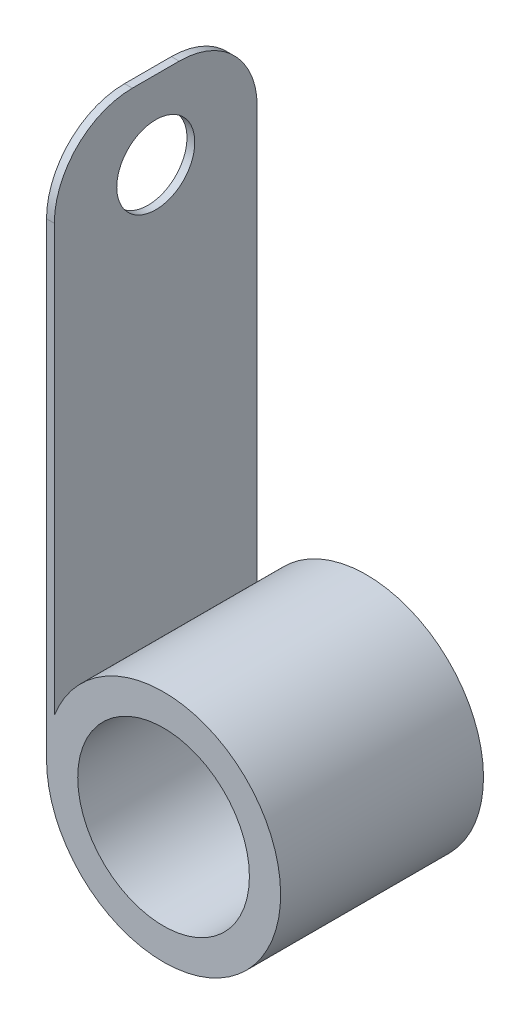
ISO-10303-21;
HEADER;
FILE_DESCRIPTION(('STEP AP214'),'2;1');
FILE_NAME('part.step','',(''),(''),'','','');
FILE_SCHEMA(('AUTOMOTIVE_DESIGN { 1 0 10303 214 1 1 1 1 }'));
ENDSEC;
DATA;
#1=APPLICATION_CONTEXT('core data for automotive mechanical design processes');
#2=APPLICATION_PROTOCOL_DEFINITION('international standard','automotive_design',2000,#1);
#3=PRODUCT_CONTEXT('',#1,'mechanical');
#4=PRODUCT('Part','Part','',(#3));
#5=PRODUCT_RELATED_PRODUCT_CATEGORY('part','',(#4));
#6=PRODUCT_DEFINITION_FORMATION('','',#4);
#7=PRODUCT_DEFINITION_CONTEXT('part definition',#1,'design');
#8=PRODUCT_DEFINITION('design','',#6,#7);
#9=PRODUCT_DEFINITION_SHAPE('','',#8);
#10=(LENGTH_UNIT() NAMED_UNIT(*) SI_UNIT(.MILLI.,.METRE.));
#11=(NAMED_UNIT(*) PLANE_ANGLE_UNIT() SI_UNIT($,.RADIAN.));
#12=(NAMED_UNIT(*) SI_UNIT($,.STERADIAN.) SOLID_ANGLE_UNIT());
#13=UNCERTAINTY_MEASURE_WITH_UNIT(LENGTH_MEASURE(1.E-05),#10,'distance_accuracy_value','');
#14=(GEOMETRIC_REPRESENTATION_CONTEXT(3) GLOBAL_UNCERTAINTY_ASSIGNED_CONTEXT((#13)) GLOBAL_UNIT_ASSIGNED_CONTEXT((#10,
#11,#12)) REPRESENTATION_CONTEXT('',''));
#15=CARTESIAN_POINT('',(0.,0.,0.));
#16=DIRECTION('',(0.,0.,1.));
#17=DIRECTION('',(1.,0.,0.));
#18=AXIS2_PLACEMENT_3D('',#15,#16,#17);
#19=CARTESIAN_POINT('',(0.,0.,13.));
#20=DIRECTION('',(0.,0.,-1.));
#21=DIRECTION('',(-1.,0.,0.));
#22=AXIS2_PLACEMENT_3D('',#19,#20,#21);
#23=CYLINDRICAL_SURFACE('',#22,7.5);
#24=DIRECTION('',(0.,0.,-1.));
#25=VECTOR('',#24,1.);
#26=CARTESIAN_POINT('',(-7.,2.69258240356726,13.));
#27=LINE('',#26,#25);
#28=CARTESIAN_POINT('',(-7.,2.69258240356726,13.));
#29=VERTEX_POINT('',#28);
#30=CARTESIAN_POINT('',(-7.,2.69258240356725,0.));
#31=VERTEX_POINT('',#30);
#32=EDGE_CURVE('E107',#29,#31,#27,.T.);
#33=ORIENTED_EDGE('',*,*,#32,.F.);
#34=CARTESIAN_POINT('',(0.,0.,13.));
#35=DIRECTION('',(0.,0.,1.));
#36=DIRECTION('',(1.,0.,0.));
#37=AXIS2_PLACEMENT_3D('',#34,#35,#36);
#38=CIRCLE('',#37,7.5);
#39=CARTESIAN_POINT('',(-7.5,0.,13.));
#40=VERTEX_POINT('',#39);
#41=EDGE_CURVE('E92',#40,#29,#38,.T.);
#42=ORIENTED_EDGE('',*,*,#41,.F.);
#43=DIRECTION('',(0.,0.,1.));
#44=VECTOR('',#43,1.);
#45=CARTESIAN_POINT('',(-7.5,0.,0.));
#46=LINE('',#45,#44);
#47=CARTESIAN_POINT('',(-7.5,0.,0.));
#48=VERTEX_POINT('',#47);
#49=EDGE_CURVE('E104',#48,#40,#46,.T.);
#50=ORIENTED_EDGE('',*,*,#49,.F.);
#51=CARTESIAN_POINT('',(0.,0.,0.));
#52=DIRECTION('',(0.,0.,1.));
#53=DIRECTION('',(1.,0.,0.));
#54=AXIS2_PLACEMENT_3D('',#51,#52,#53);
#55=CIRCLE('',#54,7.5);
#56=EDGE_CURVE('E108',#48,#31,#55,.T.);
#57=ORIENTED_EDGE('',*,*,#56,.T.);
#58=EDGE_LOOP('',(#33,#42,#50,#57));
#59=FACE_BOUND('',#58,.T.);
#60=ADVANCED_FACE('F35',(#59),#23,.T.);
#61=CARTESIAN_POINT('',(0.,0.,13.));
#62=DIRECTION('',(0.,0.,1.));
#63=DIRECTION('',(1.,0.,0.));
#64=AXIS2_PLACEMENT_3D('',#61,#62,#63);
#65=PLANE('',#64);
#66=DIRECTION('',(0.,-1.,0.));
#67=VECTOR('',#66,1.);
#68=CARTESIAN_POINT('',(-7.,35.,13.));
#69=LINE('',#68,#67);
#70=CARTESIAN_POINT('',(-7.,30.,13.));
#71=VERTEX_POINT('',#70);
#72=EDGE_CURVE('E98',#71,#29,#69,.T.);
#73=ORIENTED_EDGE('',*,*,#72,.F.);
#74=DIRECTION('',(1.,0.,0.));
#75=VECTOR('',#74,1.);
#76=CARTESIAN_POINT('',(0.,30.,13.));
#77=LINE('',#76,#75);
#78=CARTESIAN_POINT('',(-7.5,30.,13.));
#79=VERTEX_POINT('',#78);
#80=EDGE_CURVE('E11',#71,#79,#77,.F.);
#81=ORIENTED_EDGE('',*,*,#80,.T.);
#82=DIRECTION('',(0.,-1.,0.));
#83=VECTOR('',#82,1.);
#84=CARTESIAN_POINT('',(-7.5,35.,13.));
#85=LINE('',#84,#83);
#86=EDGE_CURVE('E88',#79,#40,#85,.T.);
#87=ORIENTED_EDGE('',*,*,#86,.T.);
#88=ORIENTED_EDGE('',*,*,#41,.T.);
#89=EDGE_LOOP('',(#73,#81,#87,#88));
#90=FACE_BOUND('',#89,.T.);
#91=CARTESIAN_POINT('',(0.,0.,13.));
#92=DIRECTION('',(0.,0.,1.));
#93=DIRECTION('',(1.,0.,0.));
#94=AXIS2_PLACEMENT_3D('',#91,#92,#93);
#95=CIRCLE('',#94,5.5);
#96=CARTESIAN_POINT('',(-5.5,0.,13.));
#97=VERTEX_POINT('',#96);
#98=EDGE_CURVE('E128',#97,#97,#95,.T.);
#99=ORIENTED_EDGE('',*,*,#98,.F.);
#100=EDGE_LOOP('',(#99));
#101=FACE_BOUND('',#100,.T.);
#102=ADVANCED_FACE('F90',(#90,#101),#65,.T.);
#103=CARTESIAN_POINT('',(0.,0.,0.));
#104=DIRECTION('',(0.,0.,1.));
#105=DIRECTION('',(1.,0.,0.));
#106=AXIS2_PLACEMENT_3D('',#103,#104,#105);
#107=PLANE('',#106);
#108=DIRECTION('',(0.,-1.,0.));
#109=VECTOR('',#108,1.);
#110=CARTESIAN_POINT('',(-7.5,35.,0.));
#111=LINE('',#110,#109);
#112=CARTESIAN_POINT('',(-7.5,30.,0.));
#113=VERTEX_POINT('',#112);
#114=EDGE_CURVE('E112',#113,#48,#111,.T.);
#115=ORIENTED_EDGE('',*,*,#114,.F.);
#116=DIRECTION('',(-1.,0.,0.));
#117=VECTOR('',#116,1.);
#118=CARTESIAN_POINT('',(-7.,30.,0.));
#119=LINE('',#118,#117);
#120=CARTESIAN_POINT('',(-7.,30.,0.));
#121=VERTEX_POINT('',#120);
#122=EDGE_CURVE('E58',#113,#121,#119,.F.);
#123=ORIENTED_EDGE('',*,*,#122,.T.);
#124=DIRECTION('',(0.,-1.,0.));
#125=VECTOR('',#124,1.);
#126=CARTESIAN_POINT('',(-7.,35.,0.));
#127=LINE('',#126,#125);
#128=EDGE_CURVE('E125',#121,#31,#127,.T.);
#129=ORIENTED_EDGE('',*,*,#128,.T.);
#130=ORIENTED_EDGE('',*,*,#56,.F.);
#131=EDGE_LOOP('',(#115,#123,#129,#130));
#132=FACE_BOUND('',#131,.T.);
#133=CARTESIAN_POINT('',(0.,0.,0.));
#134=DIRECTION('',(0.,0.,1.));
#135=DIRECTION('',(1.,0.,0.));
#136=AXIS2_PLACEMENT_3D('',#133,#134,#135);
#137=CIRCLE('',#136,5.5);
#138=CARTESIAN_POINT('',(-5.5,0.,0.));
#139=VERTEX_POINT('',#138);
#140=EDGE_CURVE('E97',#139,#139,#137,.T.);
#141=ORIENTED_EDGE('',*,*,#140,.T.);
#142=EDGE_LOOP('',(#141));
#143=FACE_BOUND('',#142,.T.);
#144=ADVANCED_FACE('F155',(#132,#143),#107,.F.);
#145=CARTESIAN_POINT('',(0.,0.,13.));
#146=DIRECTION('',(0.,0.,-1.));
#147=DIRECTION('',(-1.,0.,0.));
#148=AXIS2_PLACEMENT_3D('',#145,#146,#147);
#149=CYLINDRICAL_SURFACE('',#148,5.5);
#150=CARTESIAN_POINT('',(-5.5,0.,13.));
#151=CARTESIAN_POINT('',(-5.5,0.,12.8645833333333));
#152=CARTESIAN_POINT('',(-5.5,0.,12.7291666666667));
#153=CARTESIAN_POINT('',(-5.5,0.,12.4583333333333));
#154=CARTESIAN_POINT('',(-5.5,0.,12.3229166666667));
#155=CARTESIAN_POINT('',(-5.5,0.,12.0520833333333));
#156=CARTESIAN_POINT('',(-5.5,0.,11.9166666666667));
#157=CARTESIAN_POINT('',(-5.5,0.,11.6458333333333));
#158=CARTESIAN_POINT('',(-5.5,0.,11.5104166666667));
#159=CARTESIAN_POINT('',(-5.5,0.,11.2395833333333));
#160=CARTESIAN_POINT('',(-5.5,0.,11.1041666666667));
#161=CARTESIAN_POINT('',(-5.5,0.,10.8333333333333));
#162=CARTESIAN_POINT('',(-5.5,0.,10.6979166666667));
#163=CARTESIAN_POINT('',(-5.5,0.,10.4270833333333));
#164=CARTESIAN_POINT('',(-5.5,0.,10.2916666666667));
#165=CARTESIAN_POINT('',(-5.5,0.,10.0208333333333));
#166=CARTESIAN_POINT('',(-5.5,0.,9.88541666666667));
#167=CARTESIAN_POINT('',(-5.5,0.,9.61458333333333));
#168=CARTESIAN_POINT('',(-5.5,0.,9.47916666666667));
#169=CARTESIAN_POINT('',(-5.5,0.,9.20833333333333));
#170=CARTESIAN_POINT('',(-5.5,0.,9.07291666666666));
#171=CARTESIAN_POINT('',(-5.5,0.,8.80208333333333));
#172=CARTESIAN_POINT('',(-5.5,0.,8.66666666666667));
#173=CARTESIAN_POINT('',(-5.5,0.,8.39583333333333));
#174=CARTESIAN_POINT('',(-5.5,0.,8.26041666666667));
#175=CARTESIAN_POINT('',(-5.5,0.,7.98958333333333));
#176=CARTESIAN_POINT('',(-5.5,0.,7.85416666666667));
#177=CARTESIAN_POINT('',(-5.5,0.,7.58333333333333));
#178=CARTESIAN_POINT('',(-5.5,0.,7.44791666666667));
#179=CARTESIAN_POINT('',(-5.5,0.,7.17708333333333));
#180=CARTESIAN_POINT('',(-5.5,0.,7.04166666666667));
#181=CARTESIAN_POINT('',(-5.5,0.,6.77083333333333));
#182=CARTESIAN_POINT('',(-5.5,0.,6.63541666666667));
#183=CARTESIAN_POINT('',(-5.5,0.,6.36458333333333));
#184=CARTESIAN_POINT('',(-5.5,0.,6.22916666666667));
#185=CARTESIAN_POINT('',(-5.5,0.,5.95833333333333));
#186=CARTESIAN_POINT('',(-5.5,0.,5.82291666666667));
#187=CARTESIAN_POINT('',(-5.5,0.,5.55208333333333));
#188=CARTESIAN_POINT('',(-5.5,0.,5.41666666666667));
#189=CARTESIAN_POINT('',(-5.5,0.,5.14583333333333));
#190=CARTESIAN_POINT('',(-5.5,0.,5.01041666666667));
#191=CARTESIAN_POINT('',(-5.5,0.,4.73958333333333));
#192=CARTESIAN_POINT('',(-5.5,0.,4.60416666666667));
#193=CARTESIAN_POINT('',(-5.5,0.,4.33333333333333));
#194=CARTESIAN_POINT('',(-5.5,0.,4.19791666666667));
#195=CARTESIAN_POINT('',(-5.5,0.,3.92708333333333));
#196=CARTESIAN_POINT('',(-5.5,0.,3.79166666666667));
#197=CARTESIAN_POINT('',(-5.5,0.,3.52083333333333));
#198=CARTESIAN_POINT('',(-5.5,0.,3.38541666666667));
#199=CARTESIAN_POINT('',(-5.5,0.,3.11458333333333));
#200=CARTESIAN_POINT('',(-5.5,0.,2.97916666666667));
#201=CARTESIAN_POINT('',(-5.5,0.,2.70833333333333));
#202=CARTESIAN_POINT('',(-5.5,0.,2.57291666666667));
#203=CARTESIAN_POINT('',(-5.5,0.,2.30208333333333));
#204=CARTESIAN_POINT('',(-5.5,0.,2.16666666666667));
#205=CARTESIAN_POINT('',(-5.5,0.,1.89583333333333));
#206=CARTESIAN_POINT('',(-5.5,0.,1.76041666666667));
#207=CARTESIAN_POINT('',(-5.5,0.,1.48958333333333));
#208=CARTESIAN_POINT('',(-5.5,0.,1.35416666666667));
#209=CARTESIAN_POINT('',(-5.5,0.,1.08333333333333));
#210=CARTESIAN_POINT('',(-5.5,0.,0.947916666666667));
#211=CARTESIAN_POINT('',(-5.5,0.,0.677083333333334));
#212=CARTESIAN_POINT('',(-5.5,0.,0.541666666666667));
#213=CARTESIAN_POINT('',(-5.5,0.,0.270833333333334));
#214=CARTESIAN_POINT('',(-5.5,0.,0.135416666666667));
#215=CARTESIAN_POINT('',(-5.5,0.,0.));
#216=B_SPLINE_CURVE_WITH_KNOTS('',3,(#150,#151,#152,#153,#154,#155,#156,#157,#158,#159,#160,
#161,#162,#163,#164,#165,#166,#167,#168,#169,#170,#171,#172,#173,#174,#175,#176,#177,#178,#179,
#180,#181,#182,#183,#184,#185,#186,#187,#188,#189,#190,#191,#192,#193,#194,#195,#196,#197,#198,
#199,#200,#201,#202,#203,#204,#205,#206,#207,#208,#209,#210,#211,#212,#213,#214,#215),
.UNSPECIFIED.,.F.,.F.,(4,2,2,2,2,2,2,2,2,2,2,2,2,2,2,2,2,2,2,2,2,2,2,2,2,2,2,2,2,2,2,2,4),(0.,
0.40625,0.812500000000001,1.21875,1.625,2.03125,2.4375,2.84375,3.25,3.65625,4.0625,4.46875,
4.875,5.28125,5.6875,6.09375,6.5,6.90625,7.3125,7.71875,8.125,8.53125,8.9375,9.34375,9.75,
10.15625,10.5625,10.96875,11.375,11.78125,12.1875,12.59375,13.),.UNSPECIFIED.);
#217=EDGE_CURVE('BSEAM171',#97,#139,#216,.T.);
#218=ORIENTED_EDGE('',*,*,#98,.T.);
#219=ORIENTED_EDGE('',*,*,#140,.F.);
#220=ORIENTED_EDGE('',*,*,#217,.T.);
#221=ORIENTED_EDGE('',*,*,#217,.F.);
#222=EDGE_LOOP('',(#218,#220,#219,#221));
#223=FACE_BOUND('',#222,.T.);
#224=ADVANCED_FACE('F171',(#223),#149,.F.);
#225=CARTESIAN_POINT('',(-7.,35.,0.));
#226=DIRECTION('',(-1.,0.,0.));
#227=DIRECTION('',(0.,0.,1.));
#228=AXIS2_PLACEMENT_3D('',#225,#226,#227);
#229=PLANE('',#228);
#230=CARTESIAN_POINT('',(-7.,30.,6.5));
#231=DIRECTION('',(-1.,0.,0.));
#232=DIRECTION('',(0.,0.,1.));
#233=AXIS2_PLACEMENT_3D('',#230,#231,#232);
#234=CIRCLE('',#233,2.5);
#235=CARTESIAN_POINT('',(-7.,30.,9.));
#236=VERTEX_POINT('',#235);
#237=EDGE_CURVE('E114',#236,#236,#234,.T.);
#238=ORIENTED_EDGE('',*,*,#237,.T.);
#239=EDGE_LOOP('',(#238));
#240=FACE_BOUND('',#239,.T.);
#241=ORIENTED_EDGE('',*,*,#128,.F.);
#242=CARTESIAN_POINT('',(-7.,30.,5.));
#243=DIRECTION('',(-1.,0.,0.));
#244=DIRECTION('',(0.,0.,1.));
#245=AXIS2_PLACEMENT_3D('',#242,#243,#244);
#246=CIRCLE('',#245,5.);
#247=CARTESIAN_POINT('',(-7.,35.,5.));
#248=VERTEX_POINT('',#247);
#249=EDGE_CURVE('E43',#121,#248,#246,.F.);
#250=ORIENTED_EDGE('',*,*,#249,.T.);
#251=DIRECTION('',(0.,0.,-1.));
#252=VECTOR('',#251,1.);
#253=CARTESIAN_POINT('',(-7.,35.,0.));
#254=LINE('',#253,#252);
#255=CARTESIAN_POINT('',(-7.,35.,8.));
#256=VERTEX_POINT('',#255);
#257=EDGE_CURVE('E117',#256,#248,#254,.T.);
#258=ORIENTED_EDGE('',*,*,#257,.F.);
#259=CARTESIAN_POINT('',(-7.,30.,8.));
#260=DIRECTION('',(-1.,0.,0.));
#261=DIRECTION('',(0.,0.,1.));
#262=AXIS2_PLACEMENT_3D('',#259,#260,#261);
#263=CIRCLE('',#262,5.);
#264=EDGE_CURVE('E50',#256,#71,#263,.F.);
#265=ORIENTED_EDGE('',*,*,#264,.T.);
#266=ORIENTED_EDGE('',*,*,#72,.T.);
#267=ORIENTED_EDGE('',*,*,#32,.T.);
#268=EDGE_LOOP('',(#241,#250,#258,#265,#266,#267));
#269=FACE_BOUND('',#268,.T.);
#270=ADVANCED_FACE('F148',(#240,#269),#229,.F.);
#271=CARTESIAN_POINT('',(-7.5,35.,0.));
#272=DIRECTION('',(1.,0.,0.));
#273=DIRECTION('',(0.,0.,-1.));
#274=AXIS2_PLACEMENT_3D('',#271,#272,#273);
#275=PLANE('',#274);
#276=CARTESIAN_POINT('',(-7.5,30.,6.5));
#277=DIRECTION('',(-1.,0.,0.));
#278=DIRECTION('',(0.,0.,1.));
#279=AXIS2_PLACEMENT_3D('',#276,#277,#278);
#280=CIRCLE('',#279,2.5);
#281=CARTESIAN_POINT('',(-7.5,30.,9.));
#282=VERTEX_POINT('',#281);
#283=EDGE_CURVE('E120',#282,#282,#280,.T.);
#284=ORIENTED_EDGE('',*,*,#283,.F.);
#285=EDGE_LOOP('',(#284));
#286=FACE_BOUND('',#285,.T.);
#287=DIRECTION('',(0.,0.,1.));
#288=VECTOR('',#287,1.);
#289=CARTESIAN_POINT('',(-7.5,35.,0.));
#290=LINE('',#289,#288);
#291=CARTESIAN_POINT('',(-7.5,35.,5.));
#292=VERTEX_POINT('',#291);
#293=CARTESIAN_POINT('',(-7.5,35.,8.));
#294=VERTEX_POINT('',#293);
#295=EDGE_CURVE('E113',#292,#294,#290,.T.);
#296=ORIENTED_EDGE('',*,*,#295,.F.);
#297=CARTESIAN_POINT('',(-7.5,30.,5.));
#298=DIRECTION('',(1.,0.,0.));
#299=DIRECTION('',(0.,0.,-1.));
#300=AXIS2_PLACEMENT_3D('',#297,#298,#299);
#301=CIRCLE('',#300,5.);
#302=EDGE_CURVE('E143',#292,#113,#301,.F.);
#303=ORIENTED_EDGE('',*,*,#302,.T.);
#304=ORIENTED_EDGE('',*,*,#114,.T.);
#305=ORIENTED_EDGE('',*,*,#49,.T.);
#306=ORIENTED_EDGE('',*,*,#86,.F.);
#307=CARTESIAN_POINT('',(-7.5,30.,8.));
#308=DIRECTION('',(1.,0.,0.));
#309=DIRECTION('',(0.,0.,-1.));
#310=AXIS2_PLACEMENT_3D('',#307,#308,#309);
#311=CIRCLE('',#310,5.);
#312=EDGE_CURVE('E141',#79,#294,#311,.F.);
#313=ORIENTED_EDGE('',*,*,#312,.T.);
#314=EDGE_LOOP('',(#296,#303,#304,#305,#306,#313));
#315=FACE_BOUND('',#314,.T.);
#316=ADVANCED_FACE('F111',(#286,#315),#275,.F.);
#317=CARTESIAN_POINT('',(0.,35.,0.));
#318=DIRECTION('',(0.,1.,0.));
#319=DIRECTION('',(0.,0.,1.));
#320=AXIS2_PLACEMENT_3D('',#317,#318,#319);
#321=PLANE('',#320);
#322=ORIENTED_EDGE('',*,*,#257,.T.);
#323=DIRECTION('',(-1.,0.,0.));
#324=VECTOR('',#323,1.);
#325=CARTESIAN_POINT('',(-7.5,35.,5.));
#326=LINE('',#325,#324);
#327=EDGE_CURVE('E138',#248,#292,#326,.T.);
#328=ORIENTED_EDGE('',*,*,#327,.T.);
#329=ORIENTED_EDGE('',*,*,#295,.T.);
#330=DIRECTION('',(1.,0.,0.));
#331=VECTOR('',#330,1.);
#332=CARTESIAN_POINT('',(0.,35.,8.));
#333=LINE('',#332,#331);
#334=EDGE_CURVE('E135',#294,#256,#333,.T.);
#335=ORIENTED_EDGE('',*,*,#334,.T.);
#336=EDGE_LOOP('',(#322,#328,#329,#335));
#337=FACE_BOUND('',#336,.T.);
#338=ADVANCED_FACE('F152',(#337),#321,.T.);
#339=CARTESIAN_POINT('',(12.5,30.,6.5));
#340=DIRECTION('',(-1.,0.,0.));
#341=DIRECTION('',(0.,0.,1.));
#342=AXIS2_PLACEMENT_3D('',#339,#340,#341);
#343=CYLINDRICAL_SURFACE('',#342,2.5);
#344=ORIENTED_EDGE('',*,*,#283,.T.);
#345=EDGE_LOOP('',(#344));
#346=FACE_BOUND('',#345,.T.);
#347=ORIENTED_EDGE('',*,*,#237,.F.);
#348=EDGE_LOOP('',(#347));
#349=FACE_BOUND('',#348,.T.);
#350=ADVANCED_FACE('F162',(#346,#349),#343,.F.);
#351=CARTESIAN_POINT('',(0.,30.,5.));
#352=DIRECTION('',(1.,0.,0.));
#353=DIRECTION('',(0.,0.,-1.));
#354=AXIS2_PLACEMENT_3D('',#351,#352,#353);
#355=CYLINDRICAL_SURFACE('',#354,5.);
#356=ORIENTED_EDGE('',*,*,#249,.F.);
#357=ORIENTED_EDGE('',*,*,#122,.F.);
#358=ORIENTED_EDGE('',*,*,#302,.F.);
#359=ORIENTED_EDGE('',*,*,#327,.F.);
#360=EDGE_LOOP('',(#356,#357,#358,#359));
#361=FACE_BOUND('',#360,.T.);
#362=ADVANCED_FACE('F154',(#361),#355,.T.);
#363=CARTESIAN_POINT('',(0.,30.,8.));
#364=DIRECTION('',(1.,0.,0.));
#365=DIRECTION('',(0.,0.,-1.));
#366=AXIS2_PLACEMENT_3D('',#363,#364,#365);
#367=CYLINDRICAL_SURFACE('',#366,5.);
#368=ORIENTED_EDGE('',*,*,#312,.F.);
#369=ORIENTED_EDGE('',*,*,#80,.F.);
#370=ORIENTED_EDGE('',*,*,#264,.F.);
#371=ORIENTED_EDGE('',*,*,#334,.F.);
#372=EDGE_LOOP('',(#368,#369,#370,#371));
#373=FACE_BOUND('',#372,.T.);
#374=ADVANCED_FACE('F37',(#373),#367,.T.);
#375=CLOSED_SHELL('',(#60,#102,#144,#224,#270,#316,#338,#350,#362,#374));
#376=MANIFOLD_SOLID_BREP('B2',#375);
#377=ADVANCED_BREP_SHAPE_REPRESENTATION('',(#18,#376),#14);
#378=SHAPE_DEFINITION_REPRESENTATION(#9,#377);
ENDSEC;
END-ISO-10303-21;
